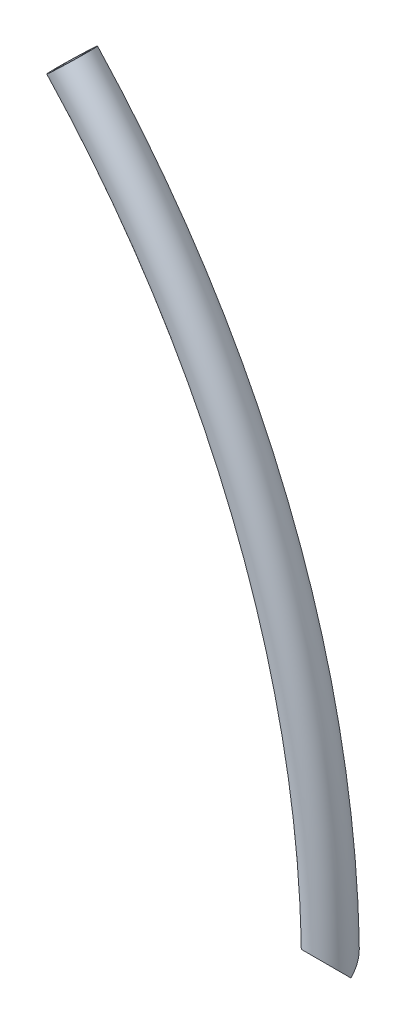
ISO-10303-21;
HEADER;
FILE_DESCRIPTION(('STEP AP214'),'2;1');
FILE_NAME('part.step','',(''),(''),'','','');
FILE_SCHEMA(('AUTOMOTIVE_DESIGN { 1 0 10303 214 1 1 1 1 }'));
ENDSEC;
DATA;
#1=APPLICATION_CONTEXT('core data for automotive mechanical design processes');
#2=APPLICATION_PROTOCOL_DEFINITION('international standard','automotive_design',2000,#1);
#3=PRODUCT_CONTEXT('',#1,'mechanical');
#4=PRODUCT('Part','Part','',(#3));
#5=PRODUCT_RELATED_PRODUCT_CATEGORY('part','',(#4));
#6=PRODUCT_DEFINITION_FORMATION('','',#4);
#7=PRODUCT_DEFINITION_CONTEXT('part definition',#1,'design');
#8=PRODUCT_DEFINITION('design','',#6,#7);
#9=PRODUCT_DEFINITION_SHAPE('','',#8);
#10=(LENGTH_UNIT() NAMED_UNIT(*) SI_UNIT(.MILLI.,.METRE.));
#11=(NAMED_UNIT(*) PLANE_ANGLE_UNIT() SI_UNIT($,.RADIAN.));
#12=(NAMED_UNIT(*) SI_UNIT($,.STERADIAN.) SOLID_ANGLE_UNIT());
#13=UNCERTAINTY_MEASURE_WITH_UNIT(LENGTH_MEASURE(1.E-05),#10,'distance_accuracy_value','');
#14=(GEOMETRIC_REPRESENTATION_CONTEXT(3) GLOBAL_UNCERTAINTY_ASSIGNED_CONTEXT((#13)) GLOBAL_UNIT_ASSIGNED_CONTEXT((#10,
#11,#12)) REPRESENTATION_CONTEXT('',''));
#15=CARTESIAN_POINT('',(0.,0.,0.));
#16=DIRECTION('',(0.,0.,1.));
#17=DIRECTION('',(1.,0.,0.));
#18=AXIS2_PLACEMENT_3D('',#15,#16,#17);
#19=CARTESIAN_POINT('',(-97.9265283162022,-91.3179649879464,-292.891733477313));
#20=DIRECTION('',(0.6819983600625,-0.731353701619169,0.));
#21=DIRECTION('',(0.731353701619169,0.6819983600625,0.));
#22=AXIS2_PLACEMENT_3D('',#19,#20,#21);
#23=PLANE('',#22);
#24=CARTESIAN_POINT('',(365.676850809585,340.99918003125,0.));
#25=DIRECTION('',(0.6819983600625,-0.731353701619169,0.));
#26=DIRECTION('',(0.731353701619169,0.6819983600625,0.));
#27=AXIS2_PLACEMENT_3D('',#24,#25,#26);
#28=CIRCLE('',#27,10.668);
#29=CARTESIAN_POINT('',(373.478932098458,348.274738536397,0.));
#30=VERTEX_POINT('',#29);
#31=EDGE_CURVE('E45',#30,#30,#28,.T.);
#32=ORIENTED_EDGE('',*,*,#31,.F.);
#33=EDGE_LOOP('',(#32));
#34=FACE_BOUND('',#33,.T.);
#35=CARTESIAN_POINT('',(365.676850809585,340.99918003125,0.));
#36=DIRECTION('',(0.6819983600625,-0.731353701619169,0.));
#37=DIRECTION('',(0.731353701619169,0.6819983600625,0.));
#38=AXIS2_PLACEMENT_3D('',#35,#36,#37);
#39=CIRCLE('',#38,7.89939999999995);
#40=CARTESIAN_POINT('',(371.454106240155,346.386557876728,0.));
#41=VERTEX_POINT('',#40);
#42=EDGE_CURVE('E11',#41,#41,#39,.F.);
#43=ORIENTED_EDGE('',*,*,#42,.F.);
#44=EDGE_LOOP('',(#43));
#45=FACE_BOUND('',#44,.T.);
#46=ADVANCED_FACE('F38',(#34,#45),#23,.F.);
#47=CARTESIAN_POINT('',(510.668,0.,0.));
#48=DIRECTION('',(0.,-0.707106781186546,0.707106781186549));
#49=DIRECTION('',(0.,-0.707106781186549,-0.707106781186546));
#50=AXIS2_PLACEMENT_3D('',#47,#48,#49);
#51=PLANE('',#50);
#52=CARTESIAN_POINT('',(510.667999998086,-0.0002,-0.000199999999999999));
#53=CARTESIAN_POINT('',(510.667996744819,0.200371116988451,0.20037111698845));
#54=CARTESIAN_POINT('',(510.662233020636,0.400919247398386,0.400919247398384));
#55=CARTESIAN_POINT('',(510.63913946314,0.801686683515423,0.80168668351542));
#56=CARTESIAN_POINT('',(510.621809358437,1.0019059813964,1.0019059813964));
#57=CARTESIAN_POINT('',(510.552355104581,1.60203847782435,1.60203847782435));
#58=CARTESIAN_POINT('',(510.482766815262,2.00101747672981,2.0010174767298));
#59=CARTESIAN_POINT('',(510.295451032568,2.79708991529621,2.7970899152962));
#60=CARTESIAN_POINT('',(510.17728014248,3.19413096913661,3.1941309691366));
#61=CARTESIAN_POINT('',(509.891523494092,3.97908780869447,3.97908780869445));
#62=CARTESIAN_POINT('',(509.723967284677,4.36700890175144,4.36700890175143));
#63=CARTESIAN_POINT('',(509.391055845679,5.02440892493937,5.02440892493935));
#64=CARTESIAN_POINT('',(509.237888173723,5.29699445338009,5.29699445338007));
#65=CARTESIAN_POINT('',(508.903911740886,5.83354184517147,5.83354184517145));
#66=CARTESIAN_POINT('',(508.723109825965,6.09750582477531,6.09750582477529));
#67=CARTESIAN_POINT('',(508.333501035643,6.61394241102197,6.61394241102195));
#68=CARTESIAN_POINT('',(508.124776819123,6.86644609663532,6.86644609663529));
#69=CARTESIAN_POINT('',(507.678022631461,7.35814122345259,7.35814122345257));
#70=CARTESIAN_POINT('',(507.440001490828,7.59733664454692,7.59733664454689));
#71=CARTESIAN_POINT('',(506.999691390717,7.99918176616671,7.99918176616669));
#72=CARTESIAN_POINT('',(506.804199924271,8.16556503067774,8.16556503067771));
#73=CARTESIAN_POINT('',(506.396504258069,8.48779824136969,8.48779824136967));
#74=CARTESIAN_POINT('',(506.184300932753,8.64364873788015,8.64364873788012));
#75=CARTESIAN_POINT('',(505.743306856474,8.94294857902636,8.94294857902633));
#76=CARTESIAN_POINT('',(505.514527905597,9.08640658935905,9.08640658935902));
#77=CARTESIAN_POINT('',(505.040540118511,9.35901876905047,9.35901876905044));
#78=CARTESIAN_POINT('',(504.795336730693,9.48817764443776,9.48817764443773));
#79=CARTESIAN_POINT('',(504.34107432931,9.70520367761914,9.70520367761911));
#80=CARTESIAN_POINT('',(504.134912033741,9.79610743823215,9.79610743823212));
#81=CARTESIAN_POINT('',(503.713305339599,9.9662778181603,9.96627781816027));
#82=CARTESIAN_POINT('',(503.497866233762,10.0455509622689,10.0455509622689));
#83=CARTESIAN_POINT('',(503.058520229182,10.1912975677941,10.1912975677941));
#84=CARTESIAN_POINT('',(502.834615063235,10.2577736316744,10.2577736316743));
#85=CARTESIAN_POINT('',(502.379478900128,10.3767833286915,10.3767833286914));
#86=CARTESIAN_POINT('',(502.148247817508,10.4293167991145,10.4293167991145));
#87=CARTESIAN_POINT('',(501.678246703876,10.5197248136,10.5197248136));
#88=CARTESIAN_POINT('',(501.439433391088,10.5574874194583,10.5574874194583));
#89=CARTESIAN_POINT('',(500.957814852442,10.616930207227,10.6169302072269));
#90=CARTESIAN_POINT('',(500.715009615355,10.6386103438912,10.6386103438911));
#91=CARTESIAN_POINT('',(500.227678490386,10.6653201026313,10.6653201026313));
#92=CARTESIAN_POINT('',(499.983153453902,10.6703574522098,10.6703574522098));
#93=CARTESIAN_POINT('',(499.494581137771,10.6636085376583,10.6636085376583));
#94=CARTESIAN_POINT('',(499.250533813667,10.6518239216056,10.6518239216055));
#95=CARTESIAN_POINT('',(498.793697608371,10.6140044950424,10.6140044950424));
#96=CARTESIAN_POINT('',(498.580599922955,10.5898033103998,10.5898033103997));
#97=CARTESIAN_POINT('',(498.158023856534,10.528848140331,10.528848140331));
#98=CARTESIAN_POINT('',(497.948545563757,10.4920938493541,10.4920938493541));
#99=CARTESIAN_POINT('',(497.534548343066,10.4066109313487,10.4066109313487));
#100=CARTESIAN_POINT('',(497.330029470625,10.3578821704495,10.3578821704495));
#101=CARTESIAN_POINT('',(496.927068712584,10.2491780671983,10.2491780671983));
#102=CARTESIAN_POINT('',(496.728627173693,10.1892020845838,10.1892020845837));
#103=CARTESIAN_POINT('',(496.332621467816,10.0567814884079,10.0567814884079));
#104=CARTESIAN_POINT('',(496.135279206261,9.98400534327626,9.98400534327622));
#105=CARTESIAN_POINT('',(495.748749133174,9.8283203696008,9.82832036960077));
#106=CARTESIAN_POINT('',(495.559563764012,9.74540853429924,9.7454085342992));
#107=CARTESIAN_POINT('',(495.005044626712,9.48287844093852,9.48287844093849));
#108=CARTESIAN_POINT('',(494.652609288206,9.28941825244707,9.28941825244703));
#109=CARTESIAN_POINT('',(494.060768207481,8.92052214057117,8.92052214057114));
#110=CARTESIAN_POINT('',(493.813861108725,8.75095715808806,8.75095715808804));
#111=CARTESIAN_POINT('',(493.342008882515,8.3971272092271,8.39712720922708));
#112=CARTESIAN_POINT('',(493.117067551344,8.21285971181849,8.21285971181846));
#113=CARTESIAN_POINT('',(492.688419563054,7.83176927591483,7.8317692759148));
#114=CARTESIAN_POINT('',(492.484760875894,7.63491952014582,7.6349195201458));
#115=CARTESIAN_POINT('',(492.098613881801,7.23115581976181,7.23115581976179));
#116=CARTESIAN_POINT('',(491.916125378969,7.02424196830019,7.02424196830017));
#117=CARTESIAN_POINT('',(491.502106497906,6.51698902362159,6.51698902362157));
#118=CARTESIAN_POINT('',(491.280453331153,6.21260670749548,6.21260670749546));
#119=CARTESIAN_POINT('',(490.875291821139,5.59136817907064,5.59136817907062));
#120=CARTESIAN_POINT('',(490.691800309844,5.27450653548845,5.27450653548843));
#121=CARTESIAN_POINT('',(490.36099341772,4.63108486110034,4.63108486110032));
#122=CARTESIAN_POINT('',(490.21372303494,4.30451332617447,4.30451332617445));
#123=CARTESIAN_POINT('',(489.954135683839,3.64460787157255,3.64460787157254));
#124=CARTESIAN_POINT('',(489.841810173048,3.31127562584678,3.31127562584677));
#125=CARTESIAN_POINT('',(489.676542617018,2.73012498579655,2.73012498579654));
#126=CARTESIAN_POINT('',(489.615754164858,2.48340149908583,2.48340149908583));
#127=CARTESIAN_POINT('',(489.511860016868,1.98812282248169,1.98812282248168));
#128=CARTESIAN_POINT('',(489.468752322873,1.73956784280542,1.73956784280542));
#129=CARTESIAN_POINT('',(489.400167077275,1.24276567544319,1.24276567544319));
#130=CARTESIAN_POINT('',(489.374584710728,0.994525680874905,0.994525680874901));
#131=CARTESIAN_POINT('',(489.340507567797,0.497455812104998,0.497455812104997));
#132=CARTESIAN_POINT('',(489.332013010863,0.248625930368906,0.248625930368904));
#133=CARTESIAN_POINT('',(489.332000001834,-0.00020000000000861,-0.000200000000008609));
#134=B_SPLINE_CURVE_WITH_KNOTS('',3,(#52,#53,#54,#55,#56,#57,#58,#59,#60,#61,#62,#63,#64,#65,
#66,#67,#68,#69,#70,#71,#72,#73,#74,#75,#76,#77,#78,#79,#80,#81,#82,#83,#84,#85,#86,#87,#88,#89,
#90,#91,#92,#93,#94,#95,#96,#97,#98,#99,#100,#101,#102,#103,#104,#105,#106,#107,#108,#109,#110,
#111,#112,#113,#114,#115,#116,#117,#118,#119,#120,#121,#122,#123,#124,#125,#126,#127,#128,#129,
#130,#131,#132,#133),.UNSPECIFIED.,.F.,.F.,(4,2,2,2,2,2,2,2,2,2,2,2,2,2,2,2,2,2,2,2,2,2,2,2,2,2,
2,2,2,2,2,2,2,2,2,2,2,2,2,2,4),(0.,0.850826504071014,1.70167297235806,3.40509509277172,
5.12442161607846,6.84272149010017,8.08617595619099,9.32932287331041,10.5688679184196,
11.8080402577638,12.7250611353381,13.6420340621312,14.5583604969309,15.4743844547804,
16.202600138868,16.9304057177892,17.6580631306361,18.3857290350641,19.1188072598744,
19.8518875471074,20.5846274059907,21.3172954819983,21.964024602278,22.6107694654908,
23.2575215594276,23.904310481737,24.5713454777077,25.2385788323366,26.5725881331718,
27.6038989119748,28.6353876150721,29.6691532489817,30.7029093161648,32.1533039974005,
33.6043370540098,35.0571637472461,36.5096350092956,37.5717342586759,38.6337134434112,
39.6892843863438,40.7448688852468),.UNSPECIFIED.);
#135=CARTESIAN_POINT('',(510.668,0.,0.));
#136=VERTEX_POINT('',#135);
#137=CARTESIAN_POINT('',(489.332,0.,0.));
#138=VERTEX_POINT('',#137);
#139=EDGE_CURVE('E57',#136,#138,#134,.T.);
#140=ORIENTED_EDGE('',*,*,#139,.T.);
#141=DIRECTION('',(-1.,0.,0.));
#142=VECTOR('',#141,1.);
#143=CARTESIAN_POINT('',(510.668,0.,0.));
#144=LINE('',#143,#142);
#145=CARTESIAN_POINT('',(492.1006,0.,0.));
#146=VERTEX_POINT('',#145);
#147=EDGE_CURVE('E52',#146,#138,#144,.T.);
#148=ORIENTED_EDGE('',*,*,#147,.F.);
#149=CARTESIAN_POINT('',(492.100600002491,-0.0002,-0.000199999999999999));
#150=CARTESIAN_POINT('',(492.10060279198,0.153059509925984,0.153059509925983));
#151=CARTESIAN_POINT('',(492.104980807596,0.306301571394974,0.306301571394973));
#152=CARTESIAN_POINT('',(492.122532289619,0.61253886843494,0.612538868434938));
#153=CARTESIAN_POINT('',(492.135706071195,0.765534094964449,0.765534094964447));
#154=CARTESIAN_POINT('',(492.188534885828,1.22422134537978,1.22422134537978));
#155=CARTESIAN_POINT('',(492.241497651142,1.52920621449486,1.52920621449486));
#156=CARTESIAN_POINT('',(492.384411178115,2.1381315926736,2.13813159267359));
#157=CARTESIAN_POINT('',(492.474749309954,2.44202650164538,2.44202650164537));
#158=CARTESIAN_POINT('',(492.693779947209,3.04269780232502,3.04269780232501));
#159=CARTESIAN_POINT('',(492.82244389269,3.33947931753733,3.33947931753732));
#160=CARTESIAN_POINT('',(493.071848232251,3.82827276246972,3.8282727624697));
#161=CARTESIAN_POINT('',(493.18166515627,4.02309357335044,4.02309357335043));
#162=CARTESIAN_POINT('',(493.420450255467,4.40676238104677,4.40676238104676));
#163=CARTESIAN_POINT('',(493.549413603688,4.59561186876424,4.59561186876422));
#164=CARTESIAN_POINT('',(493.826873795605,4.96527119751859,4.96527119751857));
#165=CARTESIAN_POINT('',(493.975308880845,5.14610413488761,5.14610413488759));
#166=CARTESIAN_POINT('',(494.292820921726,5.49847486684153,5.49847486684151));
#167=CARTESIAN_POINT('',(494.461891852229,5.67001535356349,5.67001535356347));
#168=CARTESIAN_POINT('',(494.775414298071,5.95913195470899,5.95913195470898));
#169=CARTESIAN_POINT('',(494.915109423215,6.07929249085681,6.07929249085679));
#170=CARTESIAN_POINT('',(495.2066061479,6.31213293644353,6.31213293644351));
#171=CARTESIAN_POINT('',(495.358411102693,6.42481075670004,6.42481075670002));
#172=CARTESIAN_POINT('',(495.674045871981,6.64127447796793,6.64127447796791));
#173=CARTESIAN_POINT('',(495.837867301945,6.74506647154179,6.74506647154177));
#174=CARTESIAN_POINT('',(496.177389801066,6.9423334497422,6.94233344974218));
#175=CARTESIAN_POINT('',(496.353083025506,7.03581514181505,7.03581514181503));
#176=CARTESIAN_POINT('',(496.679493617199,7.19334014984971,7.19334014984969));
#177=CARTESIAN_POINT('',(496.828146088267,7.25952616339383,7.25952616339381));
#178=CARTESIAN_POINT('',(497.132270366228,7.38344706523667,7.38344706523664));
#179=CARTESIAN_POINT('',(497.287738763103,7.44118611824489,7.44118611824487));
#180=CARTESIAN_POINT('',(497.60486067267,7.54737729521839,7.54737729521836));
#181=CARTESIAN_POINT('',(497.766512418729,7.59583204835626,7.59583204835624));
#182=CARTESIAN_POINT('',(498.095161546273,7.68266859514797,7.68266859514795));
#183=CARTESIAN_POINT('',(498.262158985456,7.72105028003544,7.72105028003542));
#184=CARTESIAN_POINT('',(498.601465605524,7.7872484777729,7.78724847777287));
#185=CARTESIAN_POINT('',(498.773802059923,7.81499538748847,7.81499538748844));
#186=CARTESIAN_POINT('',(499.121391564568,7.85902379880957,7.85902379880954));
#187=CARTESIAN_POINT('',(499.296644623042,7.87530526807234,7.87530526807231));
#188=CARTESIAN_POINT('',(499.64849859288,7.89607712172105,7.89607712172103));
#189=CARTESIAN_POINT('',(499.825099130328,7.90057066579844,7.90057066579842));
#190=CARTESIAN_POINT('',(500.178098648072,7.89771094754704,7.89771094754701));
#191=CARTESIAN_POINT('',(500.354497641953,7.89035853729673,7.89035853729671));
#192=CARTESIAN_POINT('',(500.687726219892,7.86535009701199,7.86535009701196));
#193=CARTESIAN_POINT('',(500.844726909084,7.84881409125449,7.84881409125447));
#194=CARTESIAN_POINT('',(501.156315869479,7.80664885193556,7.80664885193554));
#195=CARTESIAN_POINT('',(501.310903329038,7.78101662501254,7.78101662501251));
#196=CARTESIAN_POINT('',(501.616628690521,7.72110738504254,7.72110738504252));
#197=CARTESIAN_POINT('',(501.767767597792,7.68683292748273,7.68683292748271));
#198=CARTESIAN_POINT('',(502.065913824982,7.61015338477618,7.61015338477616));
#199=CARTESIAN_POINT('',(502.212919490182,7.56774509497806,7.56774509497804));
#200=CARTESIAN_POINT('',(502.509716097831,7.4729629265534,7.47296292655338));
#201=CARTESIAN_POINT('',(502.659246951105,7.42018224997141,7.42018224997139));
#202=CARTESIAN_POINT('',(502.952431845016,7.30697831834129,7.30697831834126));
#203=CARTESIAN_POINT('',(503.096083966521,7.24655259346976,7.24655259346974));
#204=CARTESIAN_POINT('',(503.517552198576,7.05489399143398,7.05489399143395));
#205=CARTESIAN_POINT('',(503.785966595409,6.91325145059431,6.91325145059429));
#206=CARTESIAN_POINT('',(504.434793578692,6.52426884023205,6.52426884023203));
#207=CARTESIAN_POINT('',(504.796615163054,6.26136918755647,6.26136918755645));
#208=CARTESIAN_POINT('',(505.290837988271,5.83920461990382,5.8392046199038));
#209=CARTESIAN_POINT('',(505.447702294289,5.69359626844428,5.69359626844426));
#210=CARTESIAN_POINT('',(505.745688015728,5.39448277502205,5.39448277502203));
#211=CARTESIAN_POINT('',(505.886809558873,5.2409776971408,5.24097769714078));
#212=CARTESIAN_POINT('',(506.202664847488,4.86984669354122,4.8698466935412));
#213=CARTESIAN_POINT('',(506.370710030192,4.64937546807764,4.64937546807762));
#214=CARTESIAN_POINT('',(506.679170990715,4.19893874163144,4.19893874163142));
#215=CARTESIAN_POINT('',(506.819575794418,3.96896951330092,3.9689695133009));
#216=CARTESIAN_POINT('',(507.073875927972,3.50154484902098,3.50154484902097));
#217=CARTESIAN_POINT('',(507.187740263533,3.26408102443121,3.26408102443119));
#218=CARTESIAN_POINT('',(507.389619809723,2.78379481339493,2.78379481339492));
#219=CARTESIAN_POINT('',(507.477640666393,2.54097360986041,2.5409736098604));
#220=CARTESIAN_POINT('',(507.611362218717,2.10727739287187,2.10727739287187));
#221=CARTESIAN_POINT('',(507.66213589918,1.91717248623649,1.91717248623648));
#222=CARTESIAN_POINT('',(507.748949389554,1.53530370458251,1.53530370458251));
#223=CARTESIAN_POINT('',(507.784990644832,1.34353999419165,1.34353999419165));
#224=CARTESIAN_POINT('',(507.842355527981,0.960039229044787,0.960039229044784));
#225=CARTESIAN_POINT('',(507.863762862241,0.768308402654204,0.768308402654201));
#226=CARTESIAN_POINT('',(507.892281287939,0.384317221922506,0.384317221922505));
#227=CARTESIAN_POINT('',(507.899392538813,0.192056873510744,0.192056873510744));
#228=CARTESIAN_POINT('',(507.899399997429,-0.000200000000012818,-0.000200000000012817));
#229=B_SPLINE_CURVE_WITH_KNOTS('',3,(#149,#150,#151,#152,#153,#154,#155,#156,#157,#158,#159,
#160,#161,#162,#163,#164,#165,#166,#167,#168,#169,#170,#171,#172,#173,#174,#175,#176,#177,#178,
#179,#180,#181,#182,#183,#184,#185,#186,#187,#188,#189,#190,#191,#192,#193,#194,#195,#196,#197,
#198,#199,#200,#201,#202,#203,#204,#205,#206,#207,#208,#209,#210,#211,#212,#213,#214,#215,#216,
#217,#218,#219,#220,#221,#222,#223,#224,#225,#226,#227,#228),.UNSPECIFIED.,.F.,.F.,(4,2,2,2,2,2,
2,2,2,2,2,2,2,2,2,2,2,2,2,2,2,2,2,2,2,2,2,2,2,2,2,2,2,2,2,2,2,2,2,4),(0.,0.650130402367085,
1.30028410133846,2.60232041004656,3.91820362429781,5.23310870091738,6.12226217404226,
7.01119186433749,7.89736739044062,8.78328479225496,9.44271185102166,10.1023222551209,
10.7614767138148,11.4201997931196,11.9467093186381,12.4729583713914,12.9990581774444,
13.5251636639521,14.054655918776,14.5841496672344,15.1135014731654,15.6428152045659,
16.1184726778187,16.594286824608,17.0699604389391,17.5458218504966,18.0467085188907,
18.5477574198363,19.5495723244453,21.0968445998312,21.8729254134524,22.6489999302184,
23.7100791696517,24.7715788456009,25.8343120119148,26.8968128291698,27.7172258704895,
28.5375584034494,29.3531584438431,30.1687493883405),.UNSPECIFIED.);
#230=CARTESIAN_POINT('',(507.8994,0.,0.));
#231=VERTEX_POINT('',#230);
#232=EDGE_CURVE('E70',#146,#231,#229,.T.);
#233=ORIENTED_EDGE('',*,*,#232,.T.);
#234=EDGE_CURVE('E67',#136,#231,#144,.T.);
#235=ORIENTED_EDGE('',*,*,#234,.F.);
#236=EDGE_LOOP('',(#140,#148,#233,#235));
#237=FACE_BOUND('',#236,.T.);
#238=ADVANCED_FACE('F72',(#237),#51,.T.);
#239=CARTESIAN_POINT('',(510.668,10.668,-10.668));
#240=DIRECTION('',(0.,-0.707106781186546,-0.707106781186549));
#241=DIRECTION('',(0.,0.707106781186549,-0.707106781186546));
#242=AXIS2_PLACEMENT_3D('',#239,#240,#241);
#243=PLANE('',#242);
#244=CARTESIAN_POINT('',(489.332000001834,-0.0002,0.000200000000001848));
#245=CARTESIAN_POINT('',(489.332004807442,0.207790604674334,-0.207790604674331));
#246=CARTESIAN_POINT('',(489.337942831875,0.415781548661676,-0.415781548661674));
#247=CARTESIAN_POINT('',(489.361746966915,0.831429413412198,-0.831429413412196));
#248=CARTESIAN_POINT('',(489.379613531511,1.03908632116073,-1.03908632116073));
#249=CARTESIAN_POINT('',(489.427374489089,1.45404641698093,-1.45404641698093));
#250=CARTESIAN_POINT('',(489.457288033911,1.66134851148949,-1.66134851148949));
#251=CARTESIAN_POINT('',(489.529262900184,2.07488416424767,-2.07488416424766));
#252=CARTESIAN_POINT('',(489.571324331143,2.28111771284771,-2.2811177128477));
#253=CARTESIAN_POINT('',(489.717015101701,2.90210217508579,-2.90210217508578));
#254=CARTESIAN_POINT('',(489.839653353498,3.31471614335525,-3.31471614335524));
#255=CARTESIAN_POINT('',(490.137106808386,4.13017737596751,-4.13017737596749));
#256=CARTESIAN_POINT('',(490.311881828461,4.53303190453305,-4.53303190453303));
#257=CARTESIAN_POINT('',(490.649327726264,5.19346344233508,-5.19346344233506));
#258=CARTESIAN_POINT('',(490.796816256612,5.45494291404065,-5.45494291404063));
#259=CARTESIAN_POINT('',(491.117356990146,5.96991796944615,-5.96991796944613));
#260=CARTESIAN_POINT('',(491.290402869856,6.22341550929047,-6.22341550929045));
#261=CARTESIAN_POINT('',(491.662634385966,6.71968579492062,-6.7196857949206));
#262=CARTESIAN_POINT('',(491.861736656194,6.96248957661011,-6.96248957661009));
#263=CARTESIAN_POINT('',(492.287454706716,7.43557823833689,-7.43557823833687));
#264=CARTESIAN_POINT('',(492.514062529375,7.66586671139824,-7.66586671139821));
#265=CARTESIAN_POINT('',(493.114612820675,8.22057945874869,-8.22057945874867));
#266=CARTESIAN_POINT('',(493.506287230949,8.53574394313939,-8.53574394313936));
#267=CARTESIAN_POINT('',(494.142287920622,8.97263394571088,-8.97263394571085));
#268=CARTESIAN_POINT('',(494.362357343087,9.11228168775802,-9.11228168775799));
#269=CARTESIAN_POINT('',(494.818631168345,9.37779653985827,-9.37779653985824));
#270=CARTESIAN_POINT('',(495.054832105322,9.50366659498353,-9.5036665949835));
#271=CARTESIAN_POINT('',(495.493752095377,9.71580456466062,-9.71580456466059));
#272=CARTESIAN_POINT('',(495.693694132226,9.80495362381887,-9.80495362381883));
#273=CARTESIAN_POINT('',(496.102829182097,9.97189614549288,-9.97189614549284));
#274=CARTESIAN_POINT('',(496.31202005026,10.0496922230216,-10.0496922230215));
#275=CARTESIAN_POINT('',(496.738712713608,10.1927672572915,-10.1927672572915));
#276=CARTESIAN_POINT('',(496.956210978547,10.258051461543,-10.258051461543));
#277=CARTESIAN_POINT('',(497.398410770326,10.3750663450613,-10.3750663450612));
#278=CARTESIAN_POINT('',(497.623112374633,10.426796878513,-10.426796878513));
#279=CARTESIAN_POINT('',(498.079634391466,10.5160473966893,-10.5160473966893));
#280=CARTESIAN_POINT('',(498.311490667432,10.5534760325867,-10.5534760325867));
#281=CARTESIAN_POINT('',(498.779133756108,10.612937787892,-10.612937787892));
#282=CARTESIAN_POINT('',(499.014920580083,10.6349708631653,-10.6349708631652));
#283=CARTESIAN_POINT('',(499.488328075095,10.6632199947911,-10.663219994791));
#284=CARTESIAN_POINT('',(499.725948291006,10.6694398574919,-10.6694398574918));
#285=CARTESIAN_POINT('',(500.20094581807,10.6660008521254,-10.6660008521254));
#286=CARTESIAN_POINT('',(500.438323144708,10.6563430688698,-10.6563430688697));
#287=CARTESIAN_POINT('',(500.887381302173,10.6231633085135,-10.6231633085135));
#288=CARTESIAN_POINT('',(501.099282496522,10.6011063580314,-10.6011063580313));
#289=CARTESIAN_POINT('',(501.519869443655,10.5447506462358,-10.5447506462358));
#290=CARTESIAN_POINT('',(501.728554112707,10.5104478491295,-10.5104478491295));
#291=CARTESIAN_POINT('',(502.141317532541,10.4302073690254,-10.4302073690254));
#292=CARTESIAN_POINT('',(502.345397617531,10.3842731047259,-10.3842731047259));
#293=CARTESIAN_POINT('',(502.748037307176,10.2814636271651,-10.2814636271651));
#294=CARTESIAN_POINT('',(502.946594703398,10.2245841070687,-10.2245841070686));
#295=CARTESIAN_POINT('',(503.348157709188,10.0972259047263,-10.0972259047263));
#296=CARTESIAN_POINT('',(503.550794567688,10.0261660142773,-10.0261660142773));
#297=CARTESIAN_POINT('',(503.948147460174,9.87370637768171,-9.87370637768167));
#298=CARTESIAN_POINT('',(504.142860903141,9.79230328453488,-9.79230328453485));
#299=CARTESIAN_POINT('',(504.714304743645,9.53398244918317,-9.53398244918314));
#300=CARTESIAN_POINT('',(505.078451362525,9.342916589202,-9.34291658920197));
#301=CARTESIAN_POINT('',(505.691445255077,8.97753093850642,-8.97753093850639));
#302=CARTESIAN_POINT('',(505.947691905803,8.80926845329715,-8.80926845329712));
#303=CARTESIAN_POINT('',(506.438391200603,8.45748604500478,-8.45748604500475));
#304=CARTESIAN_POINT('',(506.672840374764,8.27396370150346,-8.27396370150343));
#305=CARTESIAN_POINT('',(507.120473946921,7.89379791242834,-7.89379791242831));
#306=CARTESIAN_POINT('',(507.333612780208,7.69712779140351,-7.69712779140349));
#307=CARTESIAN_POINT('',(507.738500089437,7.2931260483445,-7.29312604834447));
#308=CARTESIAN_POINT('',(507.930248736557,7.08579451164887,-7.08579451164884));
#309=CARTESIAN_POINT('',(508.358613925918,6.58549089720609,-6.58549089720607));
#310=CARTESIAN_POINT('',(508.586329481323,6.28869724106859,-6.28869724106857));
#311=CARTESIAN_POINT('',(509.004554982977,5.68224878831054,-5.68224878831052));
#312=CARTESIAN_POINT('',(509.19505038252,5.37258902035158,-5.37258902035156));
#313=CARTESIAN_POINT('',(509.540302126475,4.74309730630075,-4.74309730630074));
#314=CARTESIAN_POINT('',(509.695017064638,4.42325405750319,-4.42325405750318));
#315=CARTESIAN_POINT('',(509.969549057773,3.77626279804402,-3.77626279804401));
#316=CARTESIAN_POINT('',(510.089373601198,3.44911637110082,-3.44911637110081));
#317=CARTESIAN_POINT('',(510.272249700735,2.86275887416544,-2.86275887416543));
#318=CARTESIAN_POINT('',(510.341998848661,2.60457678794509,-2.60457678794508));
#319=CARTESIAN_POINT('',(510.461264866577,2.0859075329754,-2.08590753297539));
#320=CARTESIAN_POINT('',(510.510783669998,1.82542058693566,-1.82542058693565));
#321=CARTESIAN_POINT('',(510.58960577984,1.30443758838714,-1.30443758838713));
#322=CARTESIAN_POINT('',(510.619023183899,1.04395012364536,-1.04395012364535));
#323=CARTESIAN_POINT('',(510.658214368479,0.522240175550507,-0.522240175550503));
#324=CARTESIAN_POINT('',(510.667988441348,0.261017703194413,-0.261017703194409));
#325=CARTESIAN_POINT('',(510.667999998086,-0.000200000000023445,0.000200000000022916));
#326=B_SPLINE_CURVE_WITH_KNOTS('',3,(#244,#245,#246,#247,#248,#249,#250,#251,#252,#253,#254,
#255,#256,#257,#258,#259,#260,#261,#262,#263,#264,#265,#266,#267,#268,#269,#270,#271,#272,#273,
#274,#275,#276,#277,#278,#279,#280,#281,#282,#283,#284,#285,#286,#287,#288,#289,#290,#291,#292,
#293,#294,#295,#296,#297,#298,#299,#300,#301,#302,#303,#304,#305,#306,#307,#308,#309,#310,#311,
#312,#313,#314,#315,#316,#317,#318,#319,#320,#321,#322,#323,#324,#325),.UNSPECIFIED.,.F.,.F.,(4,
2,2,2,2,2,2,2,2,2,2,2,2,2,2,2,2,2,2,2,2,2,2,2,2,2,2,2,2,2,2,2,2,2,2,2,2,2,2,2,4),(0.,
0.882369038555272,1.76477166116531,2.64858266736774,3.53240164101688,5.31879457562064,
7.10381423742269,8.29729858856768,9.49048813743057,10.679949427908,11.8690674117838,
13.6417024925436,14.5279306575493,15.4139690139234,16.1224319862063,16.8307315147342,
17.5387333274935,18.2467427568635,18.959201649545,19.6716625846334,20.3839520092676,
21.0961927700323,21.7380203252456,22.3800595994255,23.0219103852605,23.6640142505367,
24.3419012535084,25.0200081781044,26.3758533454068,27.4236655188771,28.4716442076096,
29.5218177521696,30.5719828919962,32.0024827298713,33.4335405347117,34.8662462081561,
36.2986441559996,37.4132805949133,38.5278104821191,39.6359604271262,40.7440938795523),.UNSPECIFIED.);
#327=EDGE_CURVE('E65',#138,#136,#326,.T.);
#328=ORIENTED_EDGE('',*,*,#327,.T.);
#329=ORIENTED_EDGE('',*,*,#234,.T.);
#330=CARTESIAN_POINT('',(507.899399997429,-0.0002,0.000200000000001414));
#331=CARTESIAN_POINT('',(507.899398877741,0.148984454909688,-0.148984454909686));
#332=CARTESIAN_POINT('',(507.895115980132,0.298153252801683,-0.298153252801681));
#333=CARTESIAN_POINT('',(507.877953088604,0.596246924656852,-0.596246924656849));
#334=CARTESIAN_POINT('',(507.865072876612,0.745171792336589,-0.745171792336586));
#335=CARTESIAN_POINT('',(507.8134499081,1.19156472725636,-1.19156472725635));
#336=CARTESIAN_POINT('',(507.761724660669,1.48833464355255,-1.48833464355254));
#337=CARTESIAN_POINT('',(507.622424406611,2.08056279442573,-2.08056279442573));
#338=CARTESIAN_POINT('',(507.53451256776,2.37598159939505,-2.37598159939504));
#339=CARTESIAN_POINT('',(507.321920417739,2.95988699827298,-2.95988699827297));
#340=CARTESIAN_POINT('',(507.19726280925,3.2483777538771,-3.24837775387709));
#341=CARTESIAN_POINT('',(506.847225298737,3.93893102742297,-3.93893102742296));
#342=CARTESIAN_POINT('',(506.601603198947,4.33610726047006,-4.33610726047005));
#343=CARTESIAN_POINT('',(506.17095075448,4.90737299740128,-4.90737299740126));
#344=CARTESIAN_POINT('',(506.017252097196,5.09350265842278,-5.09350265842276));
#345=CARTESIAN_POINT('',(505.688262561606,5.45601658982945,-5.45601658982943));
#346=CARTESIAN_POINT('',(505.51297817827,5.63240376862211,-5.63240376862209));
#347=CARTESIAN_POINT('',(505.188723047942,5.92875433243496,-5.92875433243494));
#348=CARTESIAN_POINT('',(505.044756546689,6.05146599941009,-6.05146599941007));
#349=CARTESIAN_POINT('',(504.744453749863,6.28917627772049,-6.28917627772047));
#350=CARTESIAN_POINT('',(504.588114131419,6.4041728016849,-6.40417280168487));
#351=CARTESIAN_POINT('',(504.263191749353,6.62502651889657,-6.62502651889655));
#352=CARTESIAN_POINT('',(504.094617660378,6.73089007338259,-6.73089007338256));
#353=CARTESIAN_POINT('',(503.745394206437,6.93203903116812,-6.93203903116809));
#354=CARTESIAN_POINT('',(503.564752774439,7.02733127642121,-7.02733127642119));
#355=CARTESIAN_POINT('',(503.229936989285,7.18753237365067,-7.18753237365064));
#356=CARTESIAN_POINT('',(503.077893415662,7.25467150492364,-7.25467150492361));
#357=CARTESIAN_POINT('',(502.766933147689,7.38036248776745,-7.38036248776743));
#358=CARTESIAN_POINT('',(502.608019902005,7.43891858477377,-7.43891858477374));
#359=CARTESIAN_POINT('',(502.283940608823,7.54657990829462,-7.54657990829459));
#360=CARTESIAN_POINT('',(502.11877610548,7.59568745074538,-7.59568745074535));
#361=CARTESIAN_POINT('',(501.78303425708,7.68361641180372,-7.6836164118037));
#362=CARTESIAN_POINT('',(501.612456849935,7.72243771237565,-7.72243771237562));
#363=CARTESIAN_POINT('',(501.26576002084,7.78926928423804,-7.78926928423801));
#364=CARTESIAN_POINT('',(501.089609257806,7.8171986614658,-7.81719866146577));
#365=CARTESIAN_POINT('',(500.734357561768,7.86121538006221,-7.86121538006218));
#366=CARTESIAN_POINT('',(500.555256620584,7.87730268859681,-7.87730268859678));
#367=CARTESIAN_POINT('',(500.195769043127,7.89722922141359,-7.89722922141356));
#368=CARTESIAN_POINT('',(500.015382998192,7.9010737550422,-7.90107375504217));
#369=CARTESIAN_POINT('',(499.654941306462,7.89639796949793,-7.8963979694979));
#370=CARTESIAN_POINT('',(499.474885630241,7.88787881099306,-7.88787881099304));
#371=CARTESIAN_POINT('',(499.137410931167,7.86032690496971,-7.86032690496968));
#372=CARTESIAN_POINT('',(498.979772120946,7.84261734033051,-7.84261734033049));
#373=CARTESIAN_POINT('',(498.667092666493,7.79793152807687,-7.79793152807684));
#374=CARTESIAN_POINT('',(498.512052887439,7.77095225653364,-7.77095225653362));
#375=CARTESIAN_POINT('',(498.205653988471,7.70816845738134,-7.70816845738132));
#376=CARTESIAN_POINT('',(498.054293751567,7.67236664571378,-7.67236664571375));
#377=CARTESIAN_POINT('',(497.75597100339,7.59245675947721,-7.59245675947719));
#378=CARTESIAN_POINT('',(497.609010264213,7.54834538867054,-7.54834538867052));
#379=CARTESIAN_POINT('',(497.315243673238,7.45078124637267,-7.45078124637264));
#380=CARTESIAN_POINT('',(497.168616712655,7.39705954203666,-7.39705954203663));
#381=CARTESIAN_POINT('',(496.881365569113,7.2820862987965,-7.28208629879647));
#382=CARTESIAN_POINT('',(496.74074332637,7.22083235054481,-7.22083235054479));
#383=CARTESIAN_POINT('',(496.32855188927,7.02686380267657,-7.02686380267655));
#384=CARTESIAN_POINT('',(496.066554872777,6.88390748478512,-6.88390748478509));
#385=CARTESIAN_POINT('',(495.434352558888,6.4921404573625,-6.49214045736248));
#386=CARTESIAN_POINT('',(495.082974374779,6.22809534230447,-6.22809534230445));
#387=CARTESIAN_POINT('',(494.604362306004,5.8051728764161,-5.80517287641608));
#388=CARTESIAN_POINT('',(494.452694899741,5.659465330121,-5.65946533012098));
#389=CARTESIAN_POINT('',(494.164983738688,5.36048026391956,-5.36048026391954));
#390=CARTESIAN_POINT('',(494.02893984271,5.20720281244001,-5.20720281243999));
#391=CARTESIAN_POINT('',(493.720950526596,4.83225915583276,-4.83225915583274));
#392=CARTESIAN_POINT('',(493.556229322615,4.60762668822549,-4.60762668822547));
#393=CARTESIAN_POINT('',(493.254931297913,4.14907948262484,-4.14907948262482));
#394=CARTESIAN_POINT('',(493.118366703382,3.91516076470092,-3.9151607647009));
#395=CARTESIAN_POINT('',(492.871986981975,3.4400969955691,-3.44009699556909));
#396=CARTESIAN_POINT('',(492.762204817484,3.19894344574218,-3.19894344574216));
#397=CARTESIAN_POINT('',(492.568520444695,2.71157517288166,-2.71157517288165));
#398=CARTESIAN_POINT('',(492.484612012121,2.46536168231064,-2.46536168231063));
#399=CARTESIAN_POINT('',(492.360548720304,2.03452254927581,-2.0345225492758));
#400=CARTESIAN_POINT('',(492.31469039731,1.85070318828781,-1.8507031882878));
#401=CARTESIAN_POINT('',(492.236309033285,1.48166514259735,-1.48166514259734));
#402=CARTESIAN_POINT('',(492.203784511633,1.29644661558949,-1.29644661558948));
#403=CARTESIAN_POINT('',(492.152034863087,0.926209986423744,-0.926209986423738));
#404=CARTESIAN_POINT('',(492.132731130174,0.741197346534666,-0.741197346534662));
#405=CARTESIAN_POINT('',(492.10701780763,0.37072213299229,-0.370722132992289));
#406=CARTESIAN_POINT('',(492.100608339359,0.185259555120688,-0.185259555120687));
#407=CARTESIAN_POINT('',(492.100600002491,-0.00019999999999854,0.000200000000000132));
#408=B_SPLINE_CURVE_WITH_KNOTS('',3,(#330,#331,#332,#333,#334,#335,#336,#337,#338,#339,#340,
#341,#342,#343,#344,#345,#346,#347,#348,#349,#350,#351,#352,#353,#354,#355,#356,#357,#358,#359,
#360,#361,#362,#363,#364,#365,#366,#367,#368,#369,#370,#371,#372,#373,#374,#375,#376,#377,#378,
#379,#380,#381,#382,#383,#384,#385,#386,#387,#388,#389,#390,#391,#392,#393,#394,#395,#396,#397,
#398,#399,#400,#401,#402,#403,#404,#405,#406,#407),.UNSPECIFIED.,.F.,.F.,(4,2,2,2,2,2,2,2,2,2,2,
2,2,2,2,2,2,2,2,2,2,2,2,2,2,2,2,2,2,2,2,2,2,2,2,2,2,2,4),(0.,0.632847385350427,1.26571082371454,
2.53277634728295,3.81191270784989,5.09026042868111,6.92188883064676,7.83550853228023,
8.74885400176802,9.42477801990133,10.1008841812933,10.7765155580639,11.4517070701895,
11.988981159832,12.52598859367,13.0628642334063,13.5997460335778,14.1405425767884,
14.6813406194392,15.2219041012594,15.7624168398101,16.2407075981165,16.7191545309992,
17.1974543617845,17.6759443257128,18.1708782855285,18.6659709742829,19.65581646973,
21.1850215005173,21.9521100740564,22.7191917149066,23.7911807294425,24.8636342482937,
25.937401101199,27.0109094431326,27.8025038208214,28.5940102739133,29.3807688818833,
30.1675348946785),.UNSPECIFIED.);
#409=EDGE_CURVE('E99',#231,#146,#408,.T.);
#410=ORIENTED_EDGE('',*,*,#409,.T.);
#411=ORIENTED_EDGE('',*,*,#147,.T.);
#412=EDGE_LOOP('',(#328,#329,#410,#411));
#413=FACE_BOUND('',#412,.T.);
#414=ADVANCED_FACE('F66',(#413),#243,.T.);
#415=CARTESIAN_POINT('',(0.,0.,0.));
#416=DIRECTION('',(0.,0.,-1.));
#417=DIRECTION('',(-1.,0.,0.));
#418=AXIS2_PLACEMENT_3D('',#415,#416,#417);
#419=TOROIDAL_SURFACE('',#418,500.,10.668);
#420=ORIENTED_EDGE('',*,*,#31,.T.);
#421=EDGE_LOOP('',(#420));
#422=FACE_BOUND('',#421,.T.);
#423=ORIENTED_EDGE('',*,*,#327,.F.);
#424=ORIENTED_EDGE('',*,*,#139,.F.);
#425=EDGE_LOOP('',(#423,#424));
#426=FACE_BOUND('',#425,.T.);
#427=ADVANCED_FACE('F75',(#422,#426),#419,.T.);
#428=CARTESIAN_POINT('',(0.,0.,0.));
#429=DIRECTION('',(0.,0.,-1.));
#430=DIRECTION('',(-1.,0.,0.));
#431=AXIS2_PLACEMENT_3D('',#428,#429,#430);
#432=TOROIDAL_SURFACE('',#431,500.,7.89939999999995);
#433=ORIENTED_EDGE('',*,*,#42,.T.);
#434=EDGE_LOOP('',(#433));
#435=FACE_BOUND('',#434,.T.);
#436=ORIENTED_EDGE('',*,*,#409,.F.);
#437=ORIENTED_EDGE('',*,*,#232,.F.);
#438=EDGE_LOOP('',(#436,#437));
#439=FACE_BOUND('',#438,.T.);
#440=ADVANCED_FACE('F104',(#435,#439),#432,.F.);
#441=CLOSED_SHELL('',(#46,#238,#414,#427,#440));
#442=MANIFOLD_SOLID_BREP('B2',#441);
#443=ADVANCED_BREP_SHAPE_REPRESENTATION('',(#18,#442),#14);
#444=SHAPE_DEFINITION_REPRESENTATION(#9,#443);
ENDSEC;
END-ISO-10303-21;
